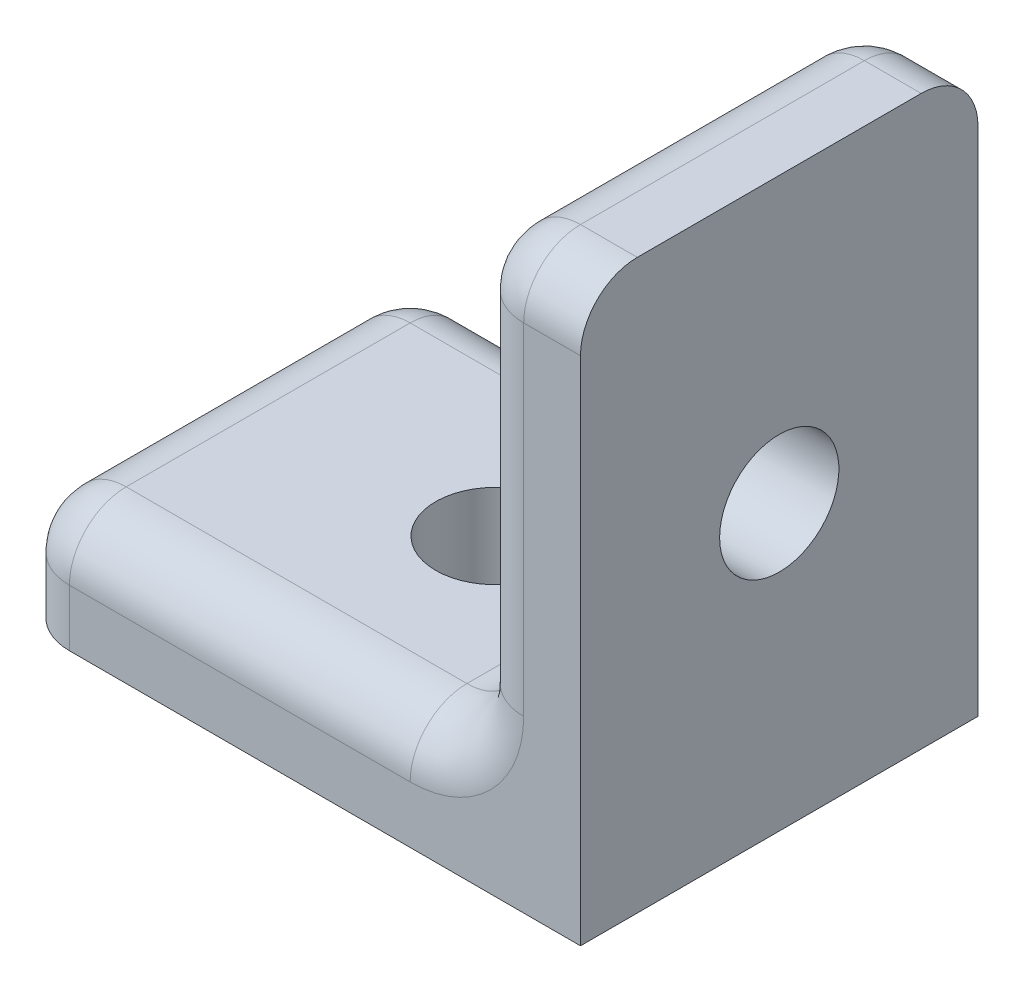
ISO-10303-21;
HEADER;
FILE_DESCRIPTION(('STEP AP214'),'2;1');
FILE_NAME('part.step','',(''),(''),'','','');
FILE_SCHEMA(('AUTOMOTIVE_DESIGN { 1 0 10303 214 1 1 1 1 }'));
ENDSEC;
DATA;
#1=APPLICATION_CONTEXT('core data for automotive mechanical design processes');
#2=APPLICATION_PROTOCOL_DEFINITION('international standard','automotive_design',2000,#1);
#3=PRODUCT_CONTEXT('',#1,'mechanical');
#4=PRODUCT('Part','Part','',(#3));
#5=PRODUCT_RELATED_PRODUCT_CATEGORY('part','',(#4));
#6=PRODUCT_DEFINITION_FORMATION('','',#4);
#7=PRODUCT_DEFINITION_CONTEXT('part definition',#1,'design');
#8=PRODUCT_DEFINITION('design','',#6,#7);
#9=PRODUCT_DEFINITION_SHAPE('','',#8);
#10=(LENGTH_UNIT() NAMED_UNIT(*) SI_UNIT(.MILLI.,.METRE.));
#11=(NAMED_UNIT(*) PLANE_ANGLE_UNIT() SI_UNIT($,.RADIAN.));
#12=(NAMED_UNIT(*) SI_UNIT($,.STERADIAN.) SOLID_ANGLE_UNIT());
#13=UNCERTAINTY_MEASURE_WITH_UNIT(LENGTH_MEASURE(1.E-05),#10,'distance_accuracy_value','');
#14=(GEOMETRIC_REPRESENTATION_CONTEXT(3) GLOBAL_UNCERTAINTY_ASSIGNED_CONTEXT((#13)) GLOBAL_UNIT_ASSIGNED_CONTEXT((#10,
#11,#12)) REPRESENTATION_CONTEXT('',''));
#15=CARTESIAN_POINT('',(0.,0.,0.));
#16=DIRECTION('',(0.,0.,1.));
#17=DIRECTION('',(1.,0.,0.));
#18=AXIS2_PLACEMENT_3D('',#15,#16,#17);
#19=CARTESIAN_POINT('',(0.,2.,3.5));
#20=DIRECTION('',(-1.,0.,0.));
#21=DIRECTION('',(0.,0.,1.));
#22=AXIS2_PLACEMENT_3D('',#19,#20,#21);
#23=PLANE('',#22);
#24=CARTESIAN_POINT('',(0.,5.,0.));
#25=DIRECTION('',(-1.,0.,0.));
#26=DIRECTION('',(0.,0.,1.));
#27=AXIS2_PLACEMENT_3D('',#24,#25,#26);
#28=CIRCLE('',#27,1.05);
#29=CARTESIAN_POINT('',(0.,5.,1.05));
#30=VERTEX_POINT('',#29);
#31=EDGE_CURVE('E341',#30,#30,#28,.T.);
#32=ORIENTED_EDGE('',*,*,#31,.T.);
#33=EDGE_LOOP('',(#32));
#34=FACE_BOUND('',#33,.T.);
#35=DIRECTION('',(0.,0.,1.));
#36=VECTOR('',#35,1.);
#37=CARTESIAN_POINT('',(0.,10.,3.5));
#38=LINE('',#37,#36);
#39=CARTESIAN_POINT('',(0.,10.,-2.5));
#40=VERTEX_POINT('',#39);
#41=CARTESIAN_POINT('',(0.,10.,2.5));
#42=VERTEX_POINT('',#41);
#43=EDGE_CURVE('E173',#40,#42,#38,.T.);
#44=ORIENTED_EDGE('',*,*,#43,.T.);
#45=CARTESIAN_POINT('',(0.,9.,2.5));
#46=DIRECTION('',(-1.,0.,0.));
#47=DIRECTION('',(0.,0.,1.));
#48=AXIS2_PLACEMENT_3D('',#45,#46,#47);
#49=CIRCLE('',#48,1.);
#50=CARTESIAN_POINT('',(0.,9.,3.5));
#51=VERTEX_POINT('',#50);
#52=EDGE_CURVE('E263',#42,#51,#49,.F.);
#53=ORIENTED_EDGE('',*,*,#52,.T.);
#54=DIRECTION('',(0.,-1.,0.));
#55=VECTOR('',#54,1.);
#56=CARTESIAN_POINT('',(0.,2.,3.5));
#57=LINE('',#56,#55);
#58=CARTESIAN_POINT('',(0.,0.,3.5));
#59=VERTEX_POINT('',#58);
#60=EDGE_CURVE('E157',#51,#59,#57,.T.);
#61=ORIENTED_EDGE('',*,*,#60,.T.);
#62=DIRECTION('',(0.,0.,-1.));
#63=VECTOR('',#62,1.);
#64=CARTESIAN_POINT('',(0.,0.,3.5));
#65=LINE('',#64,#63);
#66=CARTESIAN_POINT('',(0.,0.,-3.5));
#67=VERTEX_POINT('',#66);
#68=EDGE_CURVE('E164',#59,#67,#65,.T.);
#69=ORIENTED_EDGE('',*,*,#68,.T.);
#70=DIRECTION('',(0.,-1.,0.));
#71=VECTOR('',#70,1.);
#72=CARTESIAN_POINT('',(0.,2.,-3.5));
#73=LINE('',#72,#71);
#74=CARTESIAN_POINT('',(0.,9.,-3.5));
#75=VERTEX_POINT('',#74);
#76=EDGE_CURVE('E146',#75,#67,#73,.T.);
#77=ORIENTED_EDGE('',*,*,#76,.F.);
#78=CARTESIAN_POINT('',(0.,9.,-2.5));
#79=DIRECTION('',(-1.,0.,0.));
#80=DIRECTION('',(0.,0.,1.));
#81=AXIS2_PLACEMENT_3D('',#78,#79,#80);
#82=CIRCLE('',#81,1.);
#83=EDGE_CURVE('E260',#75,#40,#82,.F.);
#84=ORIENTED_EDGE('',*,*,#83,.T.);
#85=EDGE_LOOP('',(#44,#53,#61,#69,#77,#84));
#86=FACE_BOUND('',#85,.T.);
#87=ADVANCED_FACE('F39',(#34,#86),#23,.F.);
#88=CARTESIAN_POINT('',(-10.,2.,-3.5));
#89=DIRECTION('',(0.,0.,1.));
#90=DIRECTION('',(1.,0.,0.));
#91=AXIS2_PLACEMENT_3D('',#88,#89,#90);
#92=PLANE('',#91);
#93=DIRECTION('',(0.,1.,0.));
#94=VECTOR('',#93,1.);
#95=CARTESIAN_POINT('',(-1.,10.,-3.5));
#96=LINE('',#95,#94);
#97=CARTESIAN_POINT('',(-1.,3.,-3.5));
#98=VERTEX_POINT('',#97);
#99=CARTESIAN_POINT('',(-1.,9.,-3.5));
#100=VERTEX_POINT('',#99);
#101=EDGE_CURVE('E57',#98,#100,#96,.T.);
#102=ORIENTED_EDGE('',*,*,#101,.T.);
#103=DIRECTION('',(1.,0.,0.));
#104=VECTOR('',#103,1.);
#105=CARTESIAN_POINT('',(0.,9.,-3.5));
#106=LINE('',#105,#104);
#107=EDGE_CURVE('E151',#100,#75,#106,.T.);
#108=ORIENTED_EDGE('',*,*,#107,.T.);
#109=ORIENTED_EDGE('',*,*,#76,.T.);
#110=DIRECTION('',(-1.,0.,0.));
#111=VECTOR('',#110,1.);
#112=CARTESIAN_POINT('',(-10.,0.,-3.5));
#113=LINE('',#112,#111);
#114=CARTESIAN_POINT('',(-9.,0.,-3.5));
#115=VERTEX_POINT('',#114);
#116=EDGE_CURVE('E149',#67,#115,#113,.T.);
#117=ORIENTED_EDGE('',*,*,#116,.T.);
#118=DIRECTION('',(0.,-1.,0.));
#119=VECTOR('',#118,1.);
#120=CARTESIAN_POINT('',(-9.,2.,-3.5));
#121=LINE('',#120,#119);
#122=CARTESIAN_POINT('',(-9.,1.,-3.5));
#123=VERTEX_POINT('',#122);
#124=EDGE_CURVE('E248',#115,#123,#121,.F.);
#125=ORIENTED_EDGE('',*,*,#124,.T.);
#126=DIRECTION('',(-1.,0.,0.));
#127=VECTOR('',#126,1.);
#128=CARTESIAN_POINT('',(-10.,1.,-3.5));
#129=LINE('',#128,#127);
#130=CARTESIAN_POINT('',(-3.,1.,-3.5));
#131=VERTEX_POINT('',#130);
#132=EDGE_CURVE('E251',#123,#131,#129,.F.);
#133=ORIENTED_EDGE('',*,*,#132,.T.);
#134=CARTESIAN_POINT('',(-3.,3.,-3.5));
#135=DIRECTION('',(0.,0.,1.));
#136=DIRECTION('',(1.,0.,0.));
#137=AXIS2_PLACEMENT_3D('',#134,#135,#136);
#138=CIRCLE('',#137,2.);
#139=EDGE_CURVE('E62',#98,#131,#138,.F.);
#140=ORIENTED_EDGE('',*,*,#139,.F.);
#141=EDGE_LOOP('',(#102,#108,#109,#117,#125,#133,#140));
#142=FACE_BOUND('',#141,.T.);
#143=ADVANCED_FACE('F148',(#142),#92,.F.);
#144=CARTESIAN_POINT('',(-10.,2.,3.5));
#145=DIRECTION('',(1.,0.,0.));
#146=DIRECTION('',(0.,0.,-1.));
#147=AXIS2_PLACEMENT_3D('',#144,#145,#146);
#148=PLANE('',#147);
#149=DIRECTION('',(0.,0.,1.));
#150=VECTOR('',#149,1.);
#151=CARTESIAN_POINT('',(-10.,1.,3.5));
#152=LINE('',#151,#150);
#153=CARTESIAN_POINT('',(-10.,1.,2.5));
#154=VERTEX_POINT('',#153);
#155=CARTESIAN_POINT('',(-10.,1.,-2.5));
#156=VERTEX_POINT('',#155);
#157=EDGE_CURVE('E226',#154,#156,#152,.F.);
#158=ORIENTED_EDGE('',*,*,#157,.T.);
#159=DIRECTION('',(0.,-1.,0.));
#160=VECTOR('',#159,1.);
#161=CARTESIAN_POINT('',(-10.,2.,-2.5));
#162=LINE('',#161,#160);
#163=CARTESIAN_POINT('',(-10.,0.,-2.5));
#164=VERTEX_POINT('',#163);
#165=EDGE_CURVE('E229',#156,#164,#162,.T.);
#166=ORIENTED_EDGE('',*,*,#165,.T.);
#167=DIRECTION('',(0.,0.,1.));
#168=VECTOR('',#167,1.);
#169=CARTESIAN_POINT('',(-10.,0.,3.5));
#170=LINE('',#169,#168);
#171=CARTESIAN_POINT('',(-10.,0.,2.5));
#172=VERTEX_POINT('',#171);
#173=EDGE_CURVE('E167',#164,#172,#170,.T.);
#174=ORIENTED_EDGE('',*,*,#173,.T.);
#175=DIRECTION('',(0.,-1.,0.));
#176=VECTOR('',#175,1.);
#177=CARTESIAN_POINT('',(-10.,2.,2.5));
#178=LINE('',#177,#176);
#179=EDGE_CURVE('E223',#172,#154,#178,.F.);
#180=ORIENTED_EDGE('',*,*,#179,.T.);
#181=EDGE_LOOP('',(#158,#166,#174,#180));
#182=FACE_BOUND('',#181,.T.);
#183=ADVANCED_FACE('F370',(#182),#148,.F.);
#184=CARTESIAN_POINT('',(-10.,2.,3.5));
#185=DIRECTION('',(0.,0.,-1.));
#186=DIRECTION('',(-1.,0.,0.));
#187=AXIS2_PLACEMENT_3D('',#184,#185,#186);
#188=PLANE('',#187);
#189=ORIENTED_EDGE('',*,*,#60,.F.);
#190=DIRECTION('',(1.,0.,0.));
#191=VECTOR('',#190,1.);
#192=CARTESIAN_POINT('',(-2.,9.,3.5));
#193=LINE('',#192,#191);
#194=CARTESIAN_POINT('',(-0.999999999999999,9.,3.5));
#195=VERTEX_POINT('',#194);
#196=EDGE_CURVE('E245',#51,#195,#193,.F.);
#197=ORIENTED_EDGE('',*,*,#196,.T.);
#198=DIRECTION('',(0.,-1.,0.));
#199=VECTOR('',#198,1.);
#200=CARTESIAN_POINT('',(-0.999999999999999,2.,3.5));
#201=LINE('',#200,#199);
#202=CARTESIAN_POINT('',(-0.999999999999999,3.,3.5));
#203=VERTEX_POINT('',#202);
#204=EDGE_CURVE('E242',#195,#203,#201,.T.);
#205=ORIENTED_EDGE('',*,*,#204,.T.);
#206=CARTESIAN_POINT('',(-3.,3.,3.5));
#207=DIRECTION('',(0.,0.,-1.));
#208=DIRECTION('',(-1.,0.,0.));
#209=AXIS2_PLACEMENT_3D('',#206,#207,#208);
#210=CIRCLE('',#209,2.);
#211=CARTESIAN_POINT('',(-3.,1.,3.5));
#212=VERTEX_POINT('',#211);
#213=EDGE_CURVE('E238',#212,#203,#210,.F.);
#214=ORIENTED_EDGE('',*,*,#213,.F.);
#215=DIRECTION('',(1.,0.,0.));
#216=VECTOR('',#215,1.);
#217=CARTESIAN_POINT('',(-10.,1.,3.5));
#218=LINE('',#217,#216);
#219=CARTESIAN_POINT('',(-9.,1.,3.5));
#220=VERTEX_POINT('',#219);
#221=EDGE_CURVE('E235',#212,#220,#218,.F.);
#222=ORIENTED_EDGE('',*,*,#221,.T.);
#223=DIRECTION('',(0.,-1.,0.));
#224=VECTOR('',#223,1.);
#225=CARTESIAN_POINT('',(-9.,2.,3.5));
#226=LINE('',#225,#224);
#227=CARTESIAN_POINT('',(-9.,0.,3.5));
#228=VERTEX_POINT('',#227);
#229=EDGE_CURVE('E232',#220,#228,#226,.T.);
#230=ORIENTED_EDGE('',*,*,#229,.T.);
#231=DIRECTION('',(1.,0.,0.));
#232=VECTOR('',#231,1.);
#233=CARTESIAN_POINT('',(-10.,0.,3.5));
#234=LINE('',#233,#232);
#235=EDGE_CURVE('E183',#228,#59,#234,.T.);
#236=ORIENTED_EDGE('',*,*,#235,.T.);
#237=EDGE_LOOP('',(#189,#197,#205,#214,#222,#230,#236));
#238=FACE_BOUND('',#237,.T.);
#239=ADVANCED_FACE('F360',(#238),#188,.F.);
#240=CARTESIAN_POINT('',(0.,2.,0.));
#241=DIRECTION('',(0.,-1.,0.));
#242=DIRECTION('',(0.,0.,-1.));
#243=AXIS2_PLACEMENT_3D('',#240,#241,#242);
#244=PLANE('',#243);
#245=DIRECTION('',(0.,0.,1.));
#246=VECTOR('',#245,1.);
#247=CARTESIAN_POINT('',(-9.,2.,0.));
#248=LINE('',#247,#246);
#249=CARTESIAN_POINT('',(-9.,2.,-2.5));
#250=VERTEX_POINT('',#249);
#251=CARTESIAN_POINT('',(-9.,2.,2.5));
#252=VERTEX_POINT('',#251);
#253=EDGE_CURVE('E216',#250,#252,#248,.T.);
#254=ORIENTED_EDGE('',*,*,#253,.T.);
#255=DIRECTION('',(1.,0.,0.));
#256=VECTOR('',#255,1.);
#257=CARTESIAN_POINT('',(0.,2.,2.5));
#258=LINE('',#257,#256);
#259=CARTESIAN_POINT('',(-3.,2.,2.5));
#260=VERTEX_POINT('',#259);
#261=EDGE_CURVE('E220',#252,#260,#258,.T.);
#262=ORIENTED_EDGE('',*,*,#261,.T.);
#263=DIRECTION('',(0.,0.,-1.));
#264=VECTOR('',#263,1.);
#265=CARTESIAN_POINT('',(-3.,2.,0.));
#266=LINE('',#265,#264);
#267=CARTESIAN_POINT('',(-3.,2.,-2.5));
#268=VERTEX_POINT('',#267);
#269=EDGE_CURVE('E213',#260,#268,#266,.T.);
#270=ORIENTED_EDGE('',*,*,#269,.T.);
#271=DIRECTION('',(-1.,0.,0.));
#272=VECTOR('',#271,1.);
#273=CARTESIAN_POINT('',(0.,2.,-2.5));
#274=LINE('',#273,#272);
#275=EDGE_CURVE('E210',#268,#250,#274,.T.);
#276=ORIENTED_EDGE('',*,*,#275,.T.);
#277=EDGE_LOOP('',(#254,#262,#270,#276));
#278=FACE_BOUND('',#277,.T.);
#279=CARTESIAN_POINT('',(-5.,2.,0.));
#280=DIRECTION('',(0.,1.,0.));
#281=DIRECTION('',(0.,0.,1.));
#282=AXIS2_PLACEMENT_3D('',#279,#280,#281);
#283=CIRCLE('',#282,1.05);
#284=CARTESIAN_POINT('',(-5.,2.,1.05));
#285=VERTEX_POINT('',#284);
#286=EDGE_CURVE('E347',#285,#285,#283,.T.);
#287=ORIENTED_EDGE('',*,*,#286,.F.);
#288=EDGE_LOOP('',(#287));
#289=FACE_BOUND('',#288,.T.);
#290=ADVANCED_FACE('F358',(#278,#289),#244,.F.);
#291=CARTESIAN_POINT('',(0.,0.,0.));
#292=DIRECTION('',(0.,-1.,0.));
#293=DIRECTION('',(0.,0.,-1.));
#294=AXIS2_PLACEMENT_3D('',#291,#292,#293);
#295=PLANE('',#294);
#296=CARTESIAN_POINT('',(-5.,0.,0.));
#297=DIRECTION('',(0.,1.,0.));
#298=DIRECTION('',(0.,0.,1.));
#299=AXIS2_PLACEMENT_3D('',#296,#297,#298);
#300=CIRCLE('',#299,1.05);
#301=CARTESIAN_POINT('',(-5.,0.,1.05));
#302=VERTEX_POINT('',#301);
#303=EDGE_CURVE('E176',#302,#302,#300,.T.);
#304=ORIENTED_EDGE('',*,*,#303,.T.);
#305=EDGE_LOOP('',(#304));
#306=FACE_BOUND('',#305,.T.);
#307=ORIENTED_EDGE('',*,*,#173,.F.);
#308=CARTESIAN_POINT('',(-9.,0.,-2.5));
#309=DIRECTION('',(0.,-1.,0.));
#310=DIRECTION('',(0.,0.,-1.));
#311=AXIS2_PLACEMENT_3D('',#308,#309,#310);
#312=CIRCLE('',#311,1.);
#313=EDGE_CURVE('E11',#164,#115,#312,.T.);
#314=ORIENTED_EDGE('',*,*,#313,.T.);
#315=ORIENTED_EDGE('',*,*,#116,.F.);
#316=ORIENTED_EDGE('',*,*,#68,.F.);
#317=ORIENTED_EDGE('',*,*,#235,.F.);
#318=CARTESIAN_POINT('',(-9.,0.,2.5));
#319=DIRECTION('',(0.,-1.,0.));
#320=DIRECTION('',(0.,0.,-1.));
#321=AXIS2_PLACEMENT_3D('',#318,#319,#320);
#322=CIRCLE('',#321,1.);
#323=EDGE_CURVE('E49',#228,#172,#322,.T.);
#324=ORIENTED_EDGE('',*,*,#323,.T.);
#325=EDGE_LOOP('',(#307,#314,#315,#316,#317,#324));
#326=FACE_BOUND('',#325,.T.);
#327=ADVANCED_FACE('F162',(#306,#326),#295,.T.);
#328=CARTESIAN_POINT('',(-2.,0.,0.));
#329=DIRECTION('',(-1.,0.,0.));
#330=DIRECTION('',(0.,0.,1.));
#331=AXIS2_PLACEMENT_3D('',#328,#329,#330);
#332=PLANE('',#331);
#333=DIRECTION('',(0.,0.,-1.));
#334=VECTOR('',#333,1.);
#335=CARTESIAN_POINT('',(-2.,3.,0.));
#336=LINE('',#335,#334);
#337=CARTESIAN_POINT('',(-2.,3.,-2.5));
#338=VERTEX_POINT('',#337);
#339=CARTESIAN_POINT('',(-2.,3.,2.5));
#340=VERTEX_POINT('',#339);
#341=EDGE_CURVE('E200',#338,#340,#336,.F.);
#342=ORIENTED_EDGE('',*,*,#341,.T.);
#343=DIRECTION('',(0.,-1.,0.));
#344=VECTOR('',#343,1.);
#345=CARTESIAN_POINT('',(-2.,10.,2.5));
#346=LINE('',#345,#344);
#347=CARTESIAN_POINT('',(-2.,9.,2.5));
#348=VERTEX_POINT('',#347);
#349=EDGE_CURVE('E207',#340,#348,#346,.F.);
#350=ORIENTED_EDGE('',*,*,#349,.T.);
#351=DIRECTION('',(0.,0.,1.));
#352=VECTOR('',#351,1.);
#353=CARTESIAN_POINT('',(-2.,9.,0.));
#354=LINE('',#353,#352);
#355=CARTESIAN_POINT('',(-2.,9.,-2.5));
#356=VERTEX_POINT('',#355);
#357=EDGE_CURVE('E203',#348,#356,#354,.F.);
#358=ORIENTED_EDGE('',*,*,#357,.T.);
#359=DIRECTION('',(0.,1.,0.));
#360=VECTOR('',#359,1.);
#361=CARTESIAN_POINT('',(-2.,2.,-2.5));
#362=LINE('',#361,#360);
#363=EDGE_CURVE('E197',#356,#338,#362,.F.);
#364=ORIENTED_EDGE('',*,*,#363,.T.);
#365=EDGE_LOOP('',(#342,#350,#358,#364));
#366=FACE_BOUND('',#365,.T.);
#367=CARTESIAN_POINT('',(-2.,5.,0.));
#368=DIRECTION('',(-1.,0.,0.));
#369=DIRECTION('',(0.,0.,1.));
#370=AXIS2_PLACEMENT_3D('',#367,#368,#369);
#371=CIRCLE('',#370,1.05);
#372=CARTESIAN_POINT('',(-2.,5.,1.05));
#373=VERTEX_POINT('',#372);
#374=EDGE_CURVE('E337',#373,#373,#371,.T.);
#375=ORIENTED_EDGE('',*,*,#374,.F.);
#376=EDGE_LOOP('',(#375));
#377=FACE_BOUND('',#376,.T.);
#378=ADVANCED_FACE('F367',(#366,#377),#332,.T.);
#379=CARTESIAN_POINT('',(-2.,10.,3.5));
#380=DIRECTION('',(0.,1.,0.));
#381=DIRECTION('',(0.,0.,1.));
#382=AXIS2_PLACEMENT_3D('',#379,#380,#381);
#383=PLANE('',#382);
#384=DIRECTION('',(0.,0.,1.));
#385=VECTOR('',#384,1.);
#386=CARTESIAN_POINT('',(-1.,10.,3.5));
#387=LINE('',#386,#385);
#388=CARTESIAN_POINT('',(-1.,10.,-2.5));
#389=VERTEX_POINT('',#388);
#390=CARTESIAN_POINT('',(-1.,10.,2.5));
#391=VERTEX_POINT('',#390);
#392=EDGE_CURVE('E190',#389,#391,#387,.T.);
#393=ORIENTED_EDGE('',*,*,#392,.T.);
#394=DIRECTION('',(1.,0.,0.));
#395=VECTOR('',#394,1.);
#396=CARTESIAN_POINT('',(0.,10.,2.5));
#397=LINE('',#396,#395);
#398=EDGE_CURVE('E194',#391,#42,#397,.T.);
#399=ORIENTED_EDGE('',*,*,#398,.T.);
#400=ORIENTED_EDGE('',*,*,#43,.F.);
#401=DIRECTION('',(1.,0.,0.));
#402=VECTOR('',#401,1.);
#403=CARTESIAN_POINT('',(-2.,10.,-2.5));
#404=LINE('',#403,#402);
#405=EDGE_CURVE('E156',#40,#389,#404,.F.);
#406=ORIENTED_EDGE('',*,*,#405,.T.);
#407=EDGE_LOOP('',(#393,#399,#400,#406));
#408=FACE_BOUND('',#407,.T.);
#409=ADVANCED_FACE('F475',(#408),#383,.T.);
#410=CARTESIAN_POINT('',(-5.,0.,0.));
#411=DIRECTION('',(0.,1.,0.));
#412=DIRECTION('',(0.,0.,1.));
#413=AXIS2_PLACEMENT_3D('',#410,#411,#412);
#414=CYLINDRICAL_SURFACE('',#413,1.05);
#415=ORIENTED_EDGE('',*,*,#303,.F.);
#416=EDGE_LOOP('',(#415));
#417=FACE_BOUND('',#416,.T.);
#418=ORIENTED_EDGE('',*,*,#286,.T.);
#419=EDGE_LOOP('',(#418));
#420=FACE_BOUND('',#419,.T.);
#421=ADVANCED_FACE('F356',(#417,#420),#414,.F.);
#422=CARTESIAN_POINT('',(0.,5.,0.));
#423=DIRECTION('',(-1.,0.,0.));
#424=DIRECTION('',(0.,0.,1.));
#425=AXIS2_PLACEMENT_3D('',#422,#423,#424);
#426=CYLINDRICAL_SURFACE('',#425,1.05);
#427=ORIENTED_EDGE('',*,*,#31,.F.);
#428=EDGE_LOOP('',(#427));
#429=FACE_BOUND('',#428,.T.);
#430=ORIENTED_EDGE('',*,*,#374,.T.);
#431=EDGE_LOOP('',(#430));
#432=FACE_BOUND('',#431,.T.);
#433=ADVANCED_FACE('F447',(#429,#432),#426,.F.);
#434=CARTESIAN_POINT('',(-9.,2.,-2.5));
#435=DIRECTION('',(0.,-1.,0.));
#436=DIRECTION('',(0.,0.,-1.));
#437=AXIS2_PLACEMENT_3D('',#434,#435,#436);
#438=CYLINDRICAL_SURFACE('',#437,1.);
#439=ORIENTED_EDGE('',*,*,#313,.F.);
#440=ORIENTED_EDGE('',*,*,#165,.F.);
#441=CARTESIAN_POINT('',(-9.,1.,-2.5));
#442=DIRECTION('',(0.,1.,0.));
#443=DIRECTION('',(0.,0.,1.));
#444=AXIS2_PLACEMENT_3D('',#441,#442,#443);
#445=CIRCLE('',#444,1.);
#446=EDGE_CURVE('E329',#123,#156,#445,.T.);
#447=ORIENTED_EDGE('',*,*,#446,.F.);
#448=ORIENTED_EDGE('',*,*,#124,.F.);
#449=EDGE_LOOP('',(#439,#440,#447,#448));
#450=FACE_BOUND('',#449,.T.);
#451=ADVANCED_FACE('F41',(#450),#438,.T.);
#452=CARTESIAN_POINT('',(-9.,2.,2.5));
#453=DIRECTION('',(0.,-1.,0.));
#454=DIRECTION('',(0.,0.,-1.));
#455=AXIS2_PLACEMENT_3D('',#452,#453,#454);
#456=CYLINDRICAL_SURFACE('',#455,1.);
#457=ORIENTED_EDGE('',*,*,#323,.F.);
#458=ORIENTED_EDGE('',*,*,#229,.F.);
#459=CARTESIAN_POINT('',(-9.,1.,2.5));
#460=DIRECTION('',(0.,1.,0.));
#461=DIRECTION('',(0.,0.,1.));
#462=AXIS2_PLACEMENT_3D('',#459,#460,#461);
#463=CIRCLE('',#462,1.);
#464=EDGE_CURVE('E326',#154,#220,#463,.T.);
#465=ORIENTED_EDGE('',*,*,#464,.F.);
#466=ORIENTED_EDGE('',*,*,#179,.F.);
#467=EDGE_LOOP('',(#457,#458,#465,#466));
#468=FACE_BOUND('',#467,.T.);
#469=ADVANCED_FACE('F440',(#468),#456,.T.);
#470=CARTESIAN_POINT('',(-9.,1.,0.));
#471=DIRECTION('',(0.,0.,1.));
#472=DIRECTION('',(1.,0.,0.));
#473=AXIS2_PLACEMENT_3D('',#470,#471,#472);
#474=CYLINDRICAL_SURFACE('',#473,1.);
#475=CARTESIAN_POINT('',(-9.,1.,-2.5));
#476=DIRECTION('',(0.,0.,-1.));
#477=DIRECTION('',(0.,1.,0.));
#478=AXIS2_PLACEMENT_3D('',#475,#476,#477);
#479=CIRCLE('',#478,1.);
#480=EDGE_CURVE('E43',#156,#250,#479,.T.);
#481=ORIENTED_EDGE('',*,*,#480,.F.);
#482=ORIENTED_EDGE('',*,*,#157,.F.);
#483=CARTESIAN_POINT('',(-9.,1.,2.5));
#484=DIRECTION('',(0.,0.,1.));
#485=DIRECTION('',(1.,0.,0.));
#486=AXIS2_PLACEMENT_3D('',#483,#484,#485);
#487=CIRCLE('',#486,1.);
#488=EDGE_CURVE('E322',#252,#154,#487,.T.);
#489=ORIENTED_EDGE('',*,*,#488,.F.);
#490=ORIENTED_EDGE('',*,*,#253,.F.);
#491=EDGE_LOOP('',(#481,#482,#489,#490));
#492=FACE_BOUND('',#491,.T.);
#493=ADVANCED_FACE('F438',(#492),#474,.T.);
#494=CARTESIAN_POINT('',(-9.,1.,-2.5));
#495=DIRECTION('',(-1.,0.,0.));
#496=DIRECTION('',(0.,0.,1.));
#497=AXIS2_PLACEMENT_3D('',#494,#495,#496);
#498=SPHERICAL_SURFACE('',#497,1.);
#499=ORIENTED_EDGE('',*,*,#446,.T.);
#500=ORIENTED_EDGE('',*,*,#480,.T.);
#501=CARTESIAN_POINT('',(-9.,1.,-2.5));
#502=DIRECTION('',(-1.,0.,0.));
#503=DIRECTION('',(0.,0.,1.));
#504=AXIS2_PLACEMENT_3D('',#501,#502,#503);
#505=CIRCLE('',#504,1.);
#506=EDGE_CURVE('E318',#123,#250,#505,.F.);
#507=ORIENTED_EDGE('',*,*,#506,.F.);
#508=EDGE_LOOP('',(#499,#500,#507));
#509=FACE_BOUND('',#508,.T.);
#510=ADVANCED_FACE('F434',(#509),#498,.T.);
#511=CARTESIAN_POINT('',(-9.,1.,2.5));
#512=DIRECTION('',(-1.,0.,0.));
#513=DIRECTION('',(0.,0.,1.));
#514=AXIS2_PLACEMENT_3D('',#511,#512,#513);
#515=SPHERICAL_SURFACE('',#514,1.);
#516=ORIENTED_EDGE('',*,*,#488,.T.);
#517=ORIENTED_EDGE('',*,*,#464,.T.);
#518=CARTESIAN_POINT('',(-9.,1.,2.5));
#519=DIRECTION('',(-1.,0.,0.));
#520=DIRECTION('',(0.,0.,1.));
#521=AXIS2_PLACEMENT_3D('',#518,#519,#520);
#522=CIRCLE('',#521,1.);
#523=EDGE_CURVE('E314',#252,#220,#522,.F.);
#524=ORIENTED_EDGE('',*,*,#523,.F.);
#525=EDGE_LOOP('',(#516,#517,#524));
#526=FACE_BOUND('',#525,.T.);
#527=ADVANCED_FACE('F430',(#526),#515,.T.);
#528=CARTESIAN_POINT('',(0.,1.,-2.5));
#529=DIRECTION('',(-1.,0.,0.));
#530=DIRECTION('',(0.,0.,1.));
#531=AXIS2_PLACEMENT_3D('',#528,#529,#530);
#532=CYLINDRICAL_SURFACE('',#531,1.);
#533=ORIENTED_EDGE('',*,*,#506,.T.);
#534=ORIENTED_EDGE('',*,*,#275,.F.);
#535=CARTESIAN_POINT('',(-3.,1.,-2.5));
#536=DIRECTION('',(1.,0.,0.));
#537=DIRECTION('',(0.,0.,-1.));
#538=AXIS2_PLACEMENT_3D('',#535,#536,#537);
#539=CIRCLE('',#538,1.);
#540=EDGE_CURVE('E306',#131,#268,#539,.T.);
#541=ORIENTED_EDGE('',*,*,#540,.F.);
#542=ORIENTED_EDGE('',*,*,#132,.F.);
#543=EDGE_LOOP('',(#533,#534,#541,#542));
#544=FACE_BOUND('',#543,.T.);
#545=ADVANCED_FACE('F426',(#544),#532,.T.);
#546=CARTESIAN_POINT('',(0.,1.,2.5));
#547=DIRECTION('',(1.,0.,0.));
#548=DIRECTION('',(0.,0.,-1.));
#549=AXIS2_PLACEMENT_3D('',#546,#547,#548);
#550=CYLINDRICAL_SURFACE('',#549,1.);
#551=ORIENTED_EDGE('',*,*,#523,.T.);
#552=ORIENTED_EDGE('',*,*,#221,.F.);
#553=CARTESIAN_POINT('',(-3.,1.,2.5));
#554=DIRECTION('',(1.,0.,0.));
#555=DIRECTION('',(0.,0.,-1.));
#556=AXIS2_PLACEMENT_3D('',#553,#554,#555);
#557=CIRCLE('',#556,1.);
#558=EDGE_CURVE('E302',#260,#212,#557,.T.);
#559=ORIENTED_EDGE('',*,*,#558,.F.);
#560=ORIENTED_EDGE('',*,*,#261,.F.);
#561=EDGE_LOOP('',(#551,#552,#559,#560));
#562=FACE_BOUND('',#561,.T.);
#563=ADVANCED_FACE('F422',(#562),#550,.T.);
#564=CARTESIAN_POINT('',(-3.,3.,0.));
#565=DIRECTION('',(0.,0.,-1.));
#566=DIRECTION('',(-1.,0.,0.));
#567=AXIS2_PLACEMENT_3D('',#564,#565,#566);
#568=CYLINDRICAL_SURFACE('',#567,1.);
#569=CARTESIAN_POINT('',(-3.,3.,-2.5));
#570=DIRECTION('',(0.,0.,1.));
#571=DIRECTION('',(1.,0.,0.));
#572=AXIS2_PLACEMENT_3D('',#569,#570,#571);
#573=CIRCLE('',#572,1.);
#574=EDGE_CURVE('E310',#268,#338,#573,.T.);
#575=ORIENTED_EDGE('',*,*,#574,.F.);
#576=ORIENTED_EDGE('',*,*,#269,.F.);
#577=CARTESIAN_POINT('',(-3.,3.,2.5));
#578=DIRECTION('',(0.,0.,-1.));
#579=DIRECTION('',(-1.,0.,0.));
#580=AXIS2_PLACEMENT_3D('',#577,#578,#579);
#581=CIRCLE('',#580,1.);
#582=EDGE_CURVE('E298',#340,#260,#581,.T.);
#583=ORIENTED_EDGE('',*,*,#582,.F.);
#584=ORIENTED_EDGE('',*,*,#341,.F.);
#585=EDGE_LOOP('',(#575,#576,#583,#584));
#586=FACE_BOUND('',#585,.T.);
#587=ADVANCED_FACE('F418',(#586),#568,.F.);
#588=CARTESIAN_POINT('',(-3.,3.,-2.5));
#589=DIRECTION('',(0.,0.,1.));
#590=DIRECTION('',(1.,0.,0.));
#591=AXIS2_PLACEMENT_3D('',#588,#589,#590);
#592=TOROIDAL_SURFACE('',#591,2.,1.);
#593=ORIENTED_EDGE('',*,*,#540,.T.);
#594=ORIENTED_EDGE('',*,*,#574,.T.);
#595=CARTESIAN_POINT('',(-1.,3.,-2.5));
#596=DIRECTION('',(0.,-1.,0.));
#597=DIRECTION('',(0.,0.,-1.));
#598=AXIS2_PLACEMENT_3D('',#595,#596,#597);
#599=CIRCLE('',#598,1.);
#600=EDGE_CURVE('E294',#98,#338,#599,.F.);
#601=ORIENTED_EDGE('',*,*,#600,.F.);
#602=ORIENTED_EDGE('',*,*,#139,.T.);
#603=EDGE_LOOP('',(#593,#594,#601,#602));
#604=FACE_BOUND('',#603,.T.);
#605=ADVANCED_FACE('F414',(#604),#592,.T.);
#606=CARTESIAN_POINT('',(-3.,3.,2.5));
#607=DIRECTION('',(0.,0.,-1.));
#608=DIRECTION('',(-1.,0.,0.));
#609=AXIS2_PLACEMENT_3D('',#606,#607,#608);
#610=TOROIDAL_SURFACE('',#609,2.,1.);
#611=ORIENTED_EDGE('',*,*,#558,.T.);
#612=ORIENTED_EDGE('',*,*,#213,.T.);
#613=CARTESIAN_POINT('',(-0.999999999999999,3.,2.5));
#614=DIRECTION('',(0.,-1.,0.));
#615=DIRECTION('',(0.,0.,-1.));
#616=AXIS2_PLACEMENT_3D('',#613,#614,#615);
#617=CIRCLE('',#616,1.);
#618=EDGE_CURVE('E290',#340,#203,#617,.F.);
#619=ORIENTED_EDGE('',*,*,#618,.F.);
#620=ORIENTED_EDGE('',*,*,#582,.T.);
#621=EDGE_LOOP('',(#611,#612,#619,#620));
#622=FACE_BOUND('',#621,.T.);
#623=ADVANCED_FACE('F410',(#622),#610,.T.);
#624=CARTESIAN_POINT('',(-1.,2.,-2.5));
#625=DIRECTION('',(0.,-1.,0.));
#626=DIRECTION('',(0.,0.,-1.));
#627=AXIS2_PLACEMENT_3D('',#624,#625,#626);
#628=CYLINDRICAL_SURFACE('',#627,1.);
#629=ORIENTED_EDGE('',*,*,#600,.T.);
#630=ORIENTED_EDGE('',*,*,#363,.F.);
#631=CARTESIAN_POINT('',(-1.,9.,-2.5));
#632=DIRECTION('',(0.,1.,0.));
#633=DIRECTION('',(0.,0.,1.));
#634=AXIS2_PLACEMENT_3D('',#631,#632,#633);
#635=CIRCLE('',#634,1.);
#636=EDGE_CURVE('E286',#100,#356,#635,.T.);
#637=ORIENTED_EDGE('',*,*,#636,.F.);
#638=ORIENTED_EDGE('',*,*,#101,.F.);
#639=EDGE_LOOP('',(#629,#630,#637,#638));
#640=FACE_BOUND('',#639,.T.);
#641=ADVANCED_FACE('F406',(#640),#628,.T.);
#642=CARTESIAN_POINT('',(-10.,9.,-2.5));
#643=DIRECTION('',(-1.,0.,0.));
#644=DIRECTION('',(0.,0.,1.));
#645=AXIS2_PLACEMENT_3D('',#642,#643,#644);
#646=CYLINDRICAL_SURFACE('',#645,1.);
#647=ORIENTED_EDGE('',*,*,#83,.F.);
#648=ORIENTED_EDGE('',*,*,#107,.F.);
#649=CARTESIAN_POINT('',(-1.,9.,-2.5));
#650=DIRECTION('',(-1.,0.,0.));
#651=DIRECTION('',(0.,0.,1.));
#652=AXIS2_PLACEMENT_3D('',#649,#650,#651);
#653=CIRCLE('',#652,1.);
#654=EDGE_CURVE('E282',#389,#100,#653,.T.);
#655=ORIENTED_EDGE('',*,*,#654,.F.);
#656=ORIENTED_EDGE('',*,*,#405,.F.);
#657=EDGE_LOOP('',(#647,#648,#655,#656));
#658=FACE_BOUND('',#657,.T.);
#659=ADVANCED_FACE('F402',(#658),#646,.T.);
#660=CARTESIAN_POINT('',(-2.,9.,2.5));
#661=DIRECTION('',(-1.,0.,0.));
#662=DIRECTION('',(0.,0.,1.));
#663=AXIS2_PLACEMENT_3D('',#660,#661,#662);
#664=CYLINDRICAL_SURFACE('',#663,1.);
#665=ORIENTED_EDGE('',*,*,#52,.F.);
#666=ORIENTED_EDGE('',*,*,#398,.F.);
#667=CARTESIAN_POINT('',(-0.999999999999999,9.,2.5));
#668=DIRECTION('',(-1.,0.,0.));
#669=DIRECTION('',(0.,-1.,0.));
#670=AXIS2_PLACEMENT_3D('',#667,#668,#669);
#671=CIRCLE('',#670,1.);
#672=EDGE_CURVE('E278',#195,#391,#671,.T.);
#673=ORIENTED_EDGE('',*,*,#672,.F.);
#674=ORIENTED_EDGE('',*,*,#196,.F.);
#675=EDGE_LOOP('',(#665,#666,#673,#674));
#676=FACE_BOUND('',#675,.T.);
#677=ADVANCED_FACE('F398',(#676),#664,.T.);
#678=CARTESIAN_POINT('',(-0.999999999999999,2.,2.5));
#679=DIRECTION('',(0.,1.,0.));
#680=DIRECTION('',(0.,0.,1.));
#681=AXIS2_PLACEMENT_3D('',#678,#679,#680);
#682=CYLINDRICAL_SURFACE('',#681,1.);
#683=ORIENTED_EDGE('',*,*,#618,.T.);
#684=ORIENTED_EDGE('',*,*,#204,.F.);
#685=CARTESIAN_POINT('',(-1.,9.,2.5));
#686=DIRECTION('',(0.,1.,0.));
#687=DIRECTION('',(0.,0.,1.));
#688=AXIS2_PLACEMENT_3D('',#685,#686,#687);
#689=CIRCLE('',#688,1.);
#690=EDGE_CURVE('E274',#348,#195,#689,.T.);
#691=ORIENTED_EDGE('',*,*,#690,.F.);
#692=ORIENTED_EDGE('',*,*,#349,.F.);
#693=EDGE_LOOP('',(#683,#684,#691,#692));
#694=FACE_BOUND('',#693,.T.);
#695=ADVANCED_FACE('F394',(#694),#682,.T.);
#696=CARTESIAN_POINT('',(-1.,9.,-2.5));
#697=DIRECTION('',(0.,0.,-1.));
#698=DIRECTION('',(-1.,0.,0.));
#699=AXIS2_PLACEMENT_3D('',#696,#697,#698);
#700=SPHERICAL_SURFACE('',#699,1.);
#701=ORIENTED_EDGE('',*,*,#654,.T.);
#702=ORIENTED_EDGE('',*,*,#636,.T.);
#703=CARTESIAN_POINT('',(-1.,9.,-2.5));
#704=DIRECTION('',(0.,0.,-1.));
#705=DIRECTION('',(-1.,0.,0.));
#706=AXIS2_PLACEMENT_3D('',#703,#704,#705);
#707=CIRCLE('',#706,1.);
#708=EDGE_CURVE('E271',#389,#356,#707,.F.);
#709=ORIENTED_EDGE('',*,*,#708,.F.);
#710=EDGE_LOOP('',(#701,#702,#709));
#711=FACE_BOUND('',#710,.T.);
#712=ADVANCED_FACE('F390',(#711),#700,.T.);
#713=CARTESIAN_POINT('',(-1.,9.,2.5));
#714=DIRECTION('',(0.,0.,1.));
#715=DIRECTION('',(1.,0.,0.));
#716=AXIS2_PLACEMENT_3D('',#713,#714,#715);
#717=SPHERICAL_SURFACE('',#716,1.);
#718=ORIENTED_EDGE('',*,*,#690,.T.);
#719=ORIENTED_EDGE('',*,*,#672,.T.);
#720=CARTESIAN_POINT('',(-1.,9.,2.5));
#721=DIRECTION('',(0.,0.,1.));
#722=DIRECTION('',(1.,0.,0.));
#723=AXIS2_PLACEMENT_3D('',#720,#721,#722);
#724=CIRCLE('',#723,1.);
#725=EDGE_CURVE('E268',#348,#391,#724,.F.);
#726=ORIENTED_EDGE('',*,*,#725,.F.);
#727=EDGE_LOOP('',(#718,#719,#726));
#728=FACE_BOUND('',#727,.T.);
#729=ADVANCED_FACE('F386',(#728),#717,.T.);
#730=CARTESIAN_POINT('',(-1.,9.,3.5));
#731=DIRECTION('',(0.,0.,1.));
#732=DIRECTION('',(1.,0.,0.));
#733=AXIS2_PLACEMENT_3D('',#730,#731,#732);
#734=CYLINDRICAL_SURFACE('',#733,1.);
#735=ORIENTED_EDGE('',*,*,#708,.T.);
#736=ORIENTED_EDGE('',*,*,#357,.F.);
#737=ORIENTED_EDGE('',*,*,#725,.T.);
#738=ORIENTED_EDGE('',*,*,#392,.F.);
#739=EDGE_LOOP('',(#735,#736,#737,#738));
#740=FACE_BOUND('',#739,.T.);
#741=ADVANCED_FACE('F383',(#740),#734,.T.);
#742=CLOSED_SHELL('',(#87,#143,#183,#239,#290,#327,#378,#409,#421,#433,#451,#469,#493,#510,#527,
#545,#563,#587,#605,#623,#641,#659,#677,#695,#712,#729,#741));
#743=MANIFOLD_SOLID_BREP('B2',#742);
#744=ADVANCED_BREP_SHAPE_REPRESENTATION('',(#18,#743),#14);
#745=SHAPE_DEFINITION_REPRESENTATION(#9,#744);
ENDSEC;
END-ISO-10303-21;
